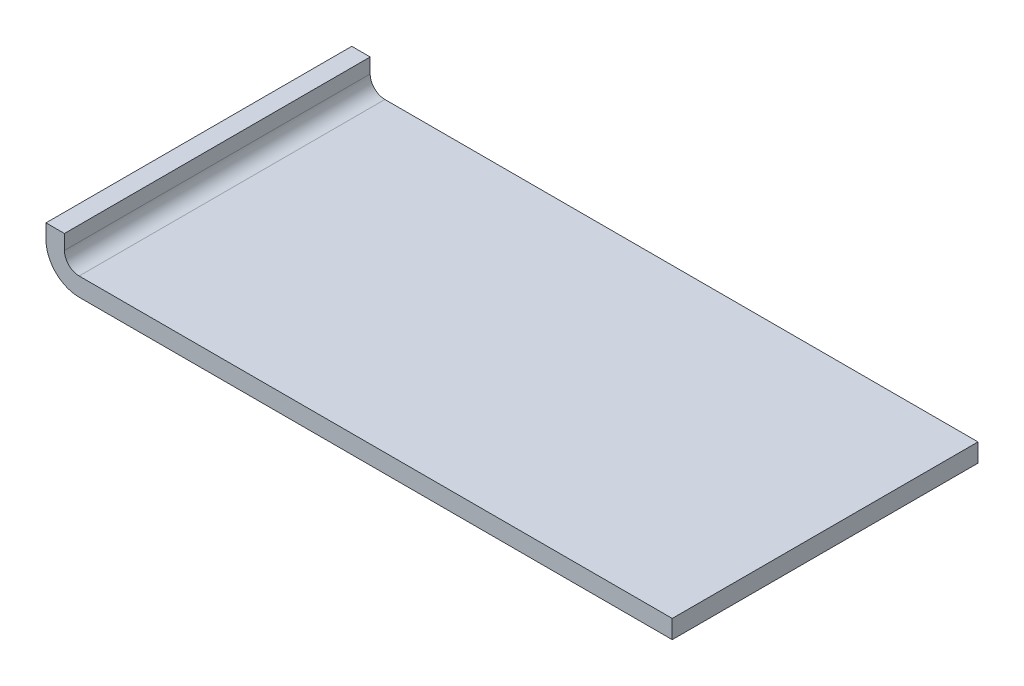
ISO-10303-21;
HEADER;
FILE_DESCRIPTION(('STEP AP214'),'2;1');
FILE_NAME('part.step','',(''),(''),'','','');
FILE_SCHEMA(('AUTOMOTIVE_DESIGN { 1 0 10303 214 1 1 1 1 }'));
ENDSEC;
DATA;
#1=APPLICATION_CONTEXT('core data for automotive mechanical design processes');
#2=APPLICATION_PROTOCOL_DEFINITION('international standard','automotive_design',2000,#1);
#3=PRODUCT_CONTEXT('',#1,'mechanical');
#4=PRODUCT('Part','Part','',(#3));
#5=PRODUCT_RELATED_PRODUCT_CATEGORY('part','',(#4));
#6=PRODUCT_DEFINITION_FORMATION('','',#4);
#7=PRODUCT_DEFINITION_CONTEXT('part definition',#1,'design');
#8=PRODUCT_DEFINITION('design','',#6,#7);
#9=PRODUCT_DEFINITION_SHAPE('','',#8);
#10=(LENGTH_UNIT() NAMED_UNIT(*) SI_UNIT(.MILLI.,.METRE.));
#11=(NAMED_UNIT(*) PLANE_ANGLE_UNIT() SI_UNIT($,.RADIAN.));
#12=(NAMED_UNIT(*) SI_UNIT($,.STERADIAN.) SOLID_ANGLE_UNIT());
#13=UNCERTAINTY_MEASURE_WITH_UNIT(LENGTH_MEASURE(1.E-05),#10,'distance_accuracy_value','');
#14=(GEOMETRIC_REPRESENTATION_CONTEXT(3) GLOBAL_UNCERTAINTY_ASSIGNED_CONTEXT((#13)) GLOBAL_UNIT_ASSIGNED_CONTEXT((#10,
#11,#12)) REPRESENTATION_CONTEXT('',''));
#15=CARTESIAN_POINT('',(0.,0.,0.));
#16=DIRECTION('',(0.,0.,1.));
#17=DIRECTION('',(1.,0.,0.));
#18=AXIS2_PLACEMENT_3D('',#15,#16,#17);
#19=CARTESIAN_POINT('',(0.399999956358547,0.399999956358547,4.15));
#20=DIRECTION('',(0.,0.,-1.));
#21=DIRECTION('',(-1.,0.,0.));
#22=AXIS2_PLACEMENT_3D('',#19,#20,#21);
#23=CYLINDRICAL_SURFACE('',#22,0.399999956358548);
#24=CARTESIAN_POINT('',(0.399999956358547,0.399999956358547,-4.15));
#25=DIRECTION('',(0.,0.,-1.));
#26=DIRECTION('',(1.,0.,0.));
#27=AXIS2_PLACEMENT_3D('',#24,#25,#26);
#28=CIRCLE('',#27,0.399999956358548);
#29=CARTESIAN_POINT('',(0.399999956358547,0.,-4.15));
#30=VERTEX_POINT('',#29);
#31=CARTESIAN_POINT('',(0.,0.4,-4.15));
#32=VERTEX_POINT('',#31);
#33=EDGE_CURVE('E140',#30,#32,#28,.T.);
#34=ORIENTED_EDGE('',*,*,#33,.T.);
#35=DIRECTION('',(0.,0.,-1.));
#36=VECTOR('',#35,1.);
#37=CARTESIAN_POINT('',(0.,0.4,4.15));
#38=LINE('',#37,#36);
#39=CARTESIAN_POINT('',(0.,0.4,4.15));
#40=VERTEX_POINT('',#39);
#41=EDGE_CURVE('E11',#40,#32,#38,.T.);
#42=ORIENTED_EDGE('',*,*,#41,.F.);
#43=CARTESIAN_POINT('',(0.399999956358547,0.399999956358547,4.15));
#44=DIRECTION('',(0.,0.,-1.));
#45=DIRECTION('',(1.,0.,0.));
#46=AXIS2_PLACEMENT_3D('',#43,#44,#45);
#47=CIRCLE('',#46,0.399999956358548);
#48=CARTESIAN_POINT('',(0.399999956358547,0.,4.15));
#49=VERTEX_POINT('',#48);
#50=EDGE_CURVE('E162',#49,#40,#47,.T.);
#51=ORIENTED_EDGE('',*,*,#50,.F.);
#52=DIRECTION('',(0.,0.,-1.));
#53=VECTOR('',#52,1.);
#54=CARTESIAN_POINT('',(0.399999956358547,0.,4.15));
#55=LINE('',#54,#53);
#56=EDGE_CURVE('E136',#49,#30,#55,.T.);
#57=ORIENTED_EDGE('',*,*,#56,.T.);
#58=EDGE_LOOP('',(#34,#42,#51,#57));
#59=FACE_BOUND('',#58,.T.);
#60=ADVANCED_FACE('F39',(#59),#23,.F.);
#61=CARTESIAN_POINT('',(0.,0.8,4.15));
#62=DIRECTION('',(-1.,0.,0.));
#63=DIRECTION('',(0.,0.,1.));
#64=AXIS2_PLACEMENT_3D('',#61,#62,#63);
#65=PLANE('',#64);
#66=DIRECTION('',(0.,1.,0.));
#67=VECTOR('',#66,1.);
#68=CARTESIAN_POINT('',(0.,0.8,-4.15));
#69=LINE('',#68,#67);
#70=CARTESIAN_POINT('',(0.,0.8,-4.15));
#71=VERTEX_POINT('',#70);
#72=EDGE_CURVE('E144',#32,#71,#69,.T.);
#73=ORIENTED_EDGE('',*,*,#72,.T.);
#74=DIRECTION('',(0.,0.,-1.));
#75=VECTOR('',#74,1.);
#76=CARTESIAN_POINT('',(0.,0.8,4.15));
#77=LINE('',#76,#75);
#78=CARTESIAN_POINT('',(0.,0.8,4.15));
#79=VERTEX_POINT('',#78);
#80=EDGE_CURVE('E48',#79,#71,#77,.T.);
#81=ORIENTED_EDGE('',*,*,#80,.F.);
#82=DIRECTION('',(0.,1.,0.));
#83=VECTOR('',#82,1.);
#84=CARTESIAN_POINT('',(0.,0.8,4.15));
#85=LINE('',#84,#83);
#86=EDGE_CURVE('E99',#40,#79,#85,.T.);
#87=ORIENTED_EDGE('',*,*,#86,.F.);
#88=ORIENTED_EDGE('',*,*,#41,.T.);
#89=EDGE_LOOP('',(#73,#81,#87,#88));
#90=FACE_BOUND('',#89,.T.);
#91=ADVANCED_FACE('F208',(#90),#65,.F.);
#92=CARTESIAN_POINT('',(-0.5,0.8,4.15));
#93=DIRECTION('',(0.,-1.,0.));
#94=DIRECTION('',(1.,0.,0.));
#95=AXIS2_PLACEMENT_3D('',#92,#93,#94);
#96=PLANE('',#95);
#97=DIRECTION('',(-1.,0.,0.));
#98=VECTOR('',#97,1.);
#99=CARTESIAN_POINT('',(-0.5,0.8,-4.15));
#100=LINE('',#99,#98);
#101=CARTESIAN_POINT('',(-0.5,0.8,-4.15));
#102=VERTEX_POINT('',#101);
#103=EDGE_CURVE('E147',#71,#102,#100,.T.);
#104=ORIENTED_EDGE('',*,*,#103,.T.);
#105=DIRECTION('',(0.,0.,-1.));
#106=VECTOR('',#105,1.);
#107=CARTESIAN_POINT('',(-0.5,0.8,4.15));
#108=LINE('',#107,#106);
#109=CARTESIAN_POINT('',(-0.5,0.8,4.15));
#110=VERTEX_POINT('',#109);
#111=EDGE_CURVE('E173',#110,#102,#108,.T.);
#112=ORIENTED_EDGE('',*,*,#111,.F.);
#113=DIRECTION('',(-1.,0.,0.));
#114=VECTOR('',#113,1.);
#115=CARTESIAN_POINT('',(-0.5,0.8,4.15));
#116=LINE('',#115,#114);
#117=EDGE_CURVE('E183',#79,#110,#116,.T.);
#118=ORIENTED_EDGE('',*,*,#117,.F.);
#119=ORIENTED_EDGE('',*,*,#80,.T.);
#120=EDGE_LOOP('',(#104,#112,#118,#119));
#121=FACE_BOUND('',#120,.T.);
#122=ADVANCED_FACE('F181',(#121),#96,.F.);
#123=CARTESIAN_POINT('',(-0.5,0.399999956358547,4.15));
#124=DIRECTION('',(1.,0.,0.));
#125=DIRECTION('',(0.,0.,-1.));
#126=AXIS2_PLACEMENT_3D('',#123,#124,#125);
#127=PLANE('',#126);
#128=DIRECTION('',(0.,-1.,0.));
#129=VECTOR('',#128,1.);
#130=CARTESIAN_POINT('',(-0.5,0.399999956358547,-4.15));
#131=LINE('',#130,#129);
#132=CARTESIAN_POINT('',(-0.5,0.399999956358547,-4.15));
#133=VERTEX_POINT('',#132);
#134=EDGE_CURVE('E150',#102,#133,#131,.T.);
#135=ORIENTED_EDGE('',*,*,#134,.T.);
#136=DIRECTION('',(0.,0.,-1.));
#137=VECTOR('',#136,1.);
#138=CARTESIAN_POINT('',(-0.5,0.399999956358547,4.15));
#139=LINE('',#138,#137);
#140=CARTESIAN_POINT('',(-0.5,0.399999956358547,4.15));
#141=VERTEX_POINT('',#140);
#142=EDGE_CURVE('E169',#141,#133,#139,.T.);
#143=ORIENTED_EDGE('',*,*,#142,.F.);
#144=DIRECTION('',(0.,-1.,0.));
#145=VECTOR('',#144,1.);
#146=CARTESIAN_POINT('',(-0.5,0.399999956358547,4.15));
#147=LINE('',#146,#145);
#148=EDGE_CURVE('E196',#110,#141,#147,.T.);
#149=ORIENTED_EDGE('',*,*,#148,.F.);
#150=ORIENTED_EDGE('',*,*,#111,.T.);
#151=EDGE_LOOP('',(#135,#143,#149,#150));
#152=FACE_BOUND('',#151,.T.);
#153=ADVANCED_FACE('F191',(#152),#127,.F.);
#154=CARTESIAN_POINT('',(0.399999956358547,0.399999956358547,4.15));
#155=DIRECTION('',(0.,0.,-1.));
#156=DIRECTION('',(-1.,0.,0.));
#157=AXIS2_PLACEMENT_3D('',#154,#155,#156);
#158=CYLINDRICAL_SURFACE('',#157,0.899999956358547);
#159=CARTESIAN_POINT('',(0.399999956358547,0.399999956358547,-4.15));
#160=DIRECTION('',(0.,0.,1.));
#161=DIRECTION('',(1.,0.,0.));
#162=AXIS2_PLACEMENT_3D('',#159,#160,#161);
#163=CIRCLE('',#162,0.899999956358547);
#164=CARTESIAN_POINT('',(0.399999956358547,-0.5,-4.15));
#165=VERTEX_POINT('',#164);
#166=EDGE_CURVE('E153',#133,#165,#163,.T.);
#167=ORIENTED_EDGE('',*,*,#166,.T.);
#168=DIRECTION('',(0.,0.,-1.));
#169=VECTOR('',#168,1.);
#170=CARTESIAN_POINT('',(0.399999956358547,-0.5,4.15));
#171=LINE('',#170,#169);
#172=CARTESIAN_POINT('',(0.399999956358547,-0.5,4.15));
#173=VERTEX_POINT('',#172);
#174=EDGE_CURVE('E129',#173,#165,#171,.T.);
#175=ORIENTED_EDGE('',*,*,#174,.F.);
#176=CARTESIAN_POINT('',(0.399999956358547,0.399999956358547,4.15));
#177=DIRECTION('',(0.,0.,1.));
#178=DIRECTION('',(1.,0.,0.));
#179=AXIS2_PLACEMENT_3D('',#176,#177,#178);
#180=CIRCLE('',#179,0.899999956358547);
#181=EDGE_CURVE('E118',#141,#173,#180,.T.);
#182=ORIENTED_EDGE('',*,*,#181,.F.);
#183=ORIENTED_EDGE('',*,*,#142,.T.);
#184=EDGE_LOOP('',(#167,#175,#182,#183));
#185=FACE_BOUND('',#184,.T.);
#186=ADVANCED_FACE('F194',(#185),#158,.T.);
#187=CARTESIAN_POINT('',(16.5,-0.5,4.15));
#188=DIRECTION('',(0.,1.,0.));
#189=DIRECTION('',(-1.,0.,0.));
#190=AXIS2_PLACEMENT_3D('',#187,#188,#189);
#191=PLANE('',#190);
#192=DIRECTION('',(1.,0.,0.));
#193=VECTOR('',#192,1.);
#194=CARTESIAN_POINT('',(16.5,-0.5,-4.15));
#195=LINE('',#194,#193);
#196=CARTESIAN_POINT('',(16.5,-0.5,-4.15));
#197=VERTEX_POINT('',#196);
#198=EDGE_CURVE('E127',#165,#197,#195,.T.);
#199=ORIENTED_EDGE('',*,*,#198,.T.);
#200=DIRECTION('',(0.,0.,-1.));
#201=VECTOR('',#200,1.);
#202=CARTESIAN_POINT('',(16.5,-0.5,4.15));
#203=LINE('',#202,#201);
#204=CARTESIAN_POINT('',(16.5,-0.5,4.15));
#205=VERTEX_POINT('',#204);
#206=EDGE_CURVE('E124',#205,#197,#203,.T.);
#207=ORIENTED_EDGE('',*,*,#206,.F.);
#208=DIRECTION('',(1.,0.,0.));
#209=VECTOR('',#208,1.);
#210=CARTESIAN_POINT('',(16.5,-0.5,4.15));
#211=LINE('',#210,#209);
#212=EDGE_CURVE('E112',#173,#205,#211,.T.);
#213=ORIENTED_EDGE('',*,*,#212,.F.);
#214=ORIENTED_EDGE('',*,*,#174,.T.);
#215=EDGE_LOOP('',(#199,#207,#213,#214));
#216=FACE_BOUND('',#215,.T.);
#217=ADVANCED_FACE('F125',(#216),#191,.F.);
#218=CARTESIAN_POINT('',(16.5,0.,4.15));
#219=DIRECTION('',(-1.,0.,0.));
#220=DIRECTION('',(0.,0.,1.));
#221=AXIS2_PLACEMENT_3D('',#218,#219,#220);
#222=PLANE('',#221);
#223=DIRECTION('',(0.,1.,0.));
#224=VECTOR('',#223,1.);
#225=CARTESIAN_POINT('',(16.5,0.,-4.15));
#226=LINE('',#225,#224);
#227=CARTESIAN_POINT('',(16.5,0.,-4.15));
#228=VERTEX_POINT('',#227);
#229=EDGE_CURVE('E85',#197,#228,#226,.T.);
#230=ORIENTED_EDGE('',*,*,#229,.T.);
#231=DIRECTION('',(0.,0.,-1.));
#232=VECTOR('',#231,1.);
#233=CARTESIAN_POINT('',(16.5,0.,4.15));
#234=LINE('',#233,#232);
#235=CARTESIAN_POINT('',(16.5,0.,4.15));
#236=VERTEX_POINT('',#235);
#237=EDGE_CURVE('E130',#236,#228,#234,.T.);
#238=ORIENTED_EDGE('',*,*,#237,.F.);
#239=DIRECTION('',(0.,1.,0.));
#240=VECTOR('',#239,1.);
#241=CARTESIAN_POINT('',(16.5,0.,4.15));
#242=LINE('',#241,#240);
#243=EDGE_CURVE('E116',#205,#236,#242,.T.);
#244=ORIENTED_EDGE('',*,*,#243,.F.);
#245=ORIENTED_EDGE('',*,*,#206,.T.);
#246=EDGE_LOOP('',(#230,#238,#244,#245));
#247=FACE_BOUND('',#246,.T.);
#248=ADVANCED_FACE('F132',(#247),#222,.F.);
#249=CARTESIAN_POINT('',(0.399999956358547,0.,4.15));
#250=DIRECTION('',(0.,-1.,0.));
#251=DIRECTION('',(1.,0.,0.));
#252=AXIS2_PLACEMENT_3D('',#249,#250,#251);
#253=PLANE('',#252);
#254=DIRECTION('',(-1.,0.,0.));
#255=VECTOR('',#254,1.);
#256=CARTESIAN_POINT('',(0.399999956358547,0.,-4.15));
#257=LINE('',#256,#255);
#258=EDGE_CURVE('E91',#228,#30,#257,.T.);
#259=ORIENTED_EDGE('',*,*,#258,.T.);
#260=ORIENTED_EDGE('',*,*,#56,.F.);
#261=DIRECTION('',(-1.,0.,0.));
#262=VECTOR('',#261,1.);
#263=CARTESIAN_POINT('',(0.399999956358547,0.,4.15));
#264=LINE('',#263,#262);
#265=EDGE_CURVE('E56',#236,#49,#264,.T.);
#266=ORIENTED_EDGE('',*,*,#265,.F.);
#267=ORIENTED_EDGE('',*,*,#237,.T.);
#268=EDGE_LOOP('',(#259,#260,#266,#267));
#269=FACE_BOUND('',#268,.T.);
#270=ADVANCED_FACE('F224',(#269),#253,.F.);
#271=CARTESIAN_POINT('',(0.399999956358547,0.399999956358547,4.15));
#272=DIRECTION('',(0.,0.,1.));
#273=DIRECTION('',(1.,0.,0.));
#274=AXIS2_PLACEMENT_3D('',#271,#272,#273);
#275=PLANE('',#274);
#276=ORIENTED_EDGE('',*,*,#50,.T.);
#277=ORIENTED_EDGE('',*,*,#86,.T.);
#278=ORIENTED_EDGE('',*,*,#117,.T.);
#279=ORIENTED_EDGE('',*,*,#148,.T.);
#280=ORIENTED_EDGE('',*,*,#181,.T.);
#281=ORIENTED_EDGE('',*,*,#212,.T.);
#282=ORIENTED_EDGE('',*,*,#243,.T.);
#283=ORIENTED_EDGE('',*,*,#265,.T.);
#284=EDGE_LOOP('',(#276,#277,#278,#279,#280,#281,#282,#283));
#285=FACE_BOUND('',#284,.T.);
#286=ADVANCED_FACE('F114',(#285),#275,.T.);
#287=CARTESIAN_POINT('',(0.399999956358547,0.399999956358547,-4.15));
#288=DIRECTION('',(0.,0.,1.));
#289=DIRECTION('',(1.,0.,0.));
#290=AXIS2_PLACEMENT_3D('',#287,#288,#289);
#291=PLANE('',#290);
#292=ORIENTED_EDGE('',*,*,#33,.F.);
#293=ORIENTED_EDGE('',*,*,#258,.F.);
#294=ORIENTED_EDGE('',*,*,#229,.F.);
#295=ORIENTED_EDGE('',*,*,#198,.F.);
#296=ORIENTED_EDGE('',*,*,#166,.F.);
#297=ORIENTED_EDGE('',*,*,#134,.F.);
#298=ORIENTED_EDGE('',*,*,#103,.F.);
#299=ORIENTED_EDGE('',*,*,#72,.F.);
#300=EDGE_LOOP('',(#292,#293,#294,#295,#296,#297,#298,#299));
#301=FACE_BOUND('',#300,.T.);
#302=ADVANCED_FACE('F187',(#301),#291,.F.);
#303=CLOSED_SHELL('',(#60,#91,#122,#153,#186,#217,#248,#270,#286,#302));
#304=MANIFOLD_SOLID_BREP('B2',#303);
#305=ADVANCED_BREP_SHAPE_REPRESENTATION('',(#18,#304),#14);
#306=SHAPE_DEFINITION_REPRESENTATION(#9,#305);
ENDSEC;
END-ISO-10303-21;
